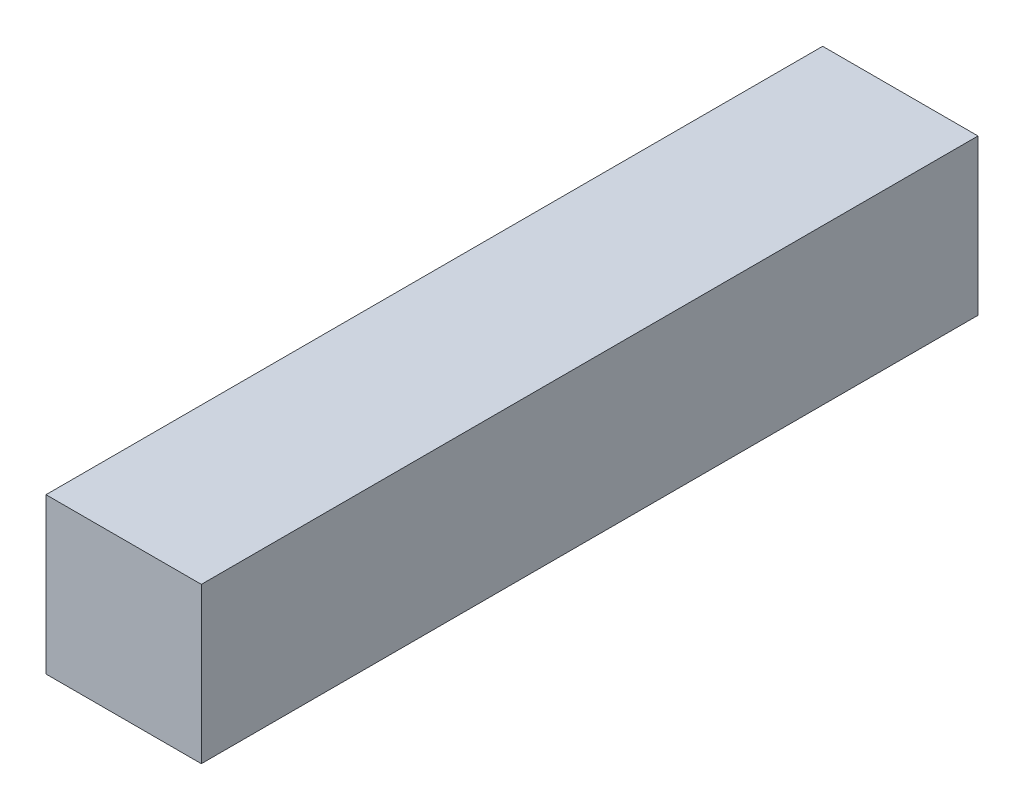
ISO-10303-21;
HEADER;
FILE_DESCRIPTION(('STEP AP214'),'2;1');
FILE_NAME('part.step','',(''),(''),'','','');
FILE_SCHEMA(('AUTOMOTIVE_DESIGN { 1 0 10303 214 1 1 1 1 }'));
ENDSEC;
DATA;
#1=APPLICATION_CONTEXT('core data for automotive mechanical design processes');
#2=APPLICATION_PROTOCOL_DEFINITION('international standard','automotive_design',2000,#1);
#3=PRODUCT_CONTEXT('',#1,'mechanical');
#4=PRODUCT('Part','Part','',(#3));
#5=PRODUCT_RELATED_PRODUCT_CATEGORY('part','',(#4));
#6=PRODUCT_DEFINITION_FORMATION('','',#4);
#7=PRODUCT_DEFINITION_CONTEXT('part definition',#1,'design');
#8=PRODUCT_DEFINITION('design','',#6,#7);
#9=PRODUCT_DEFINITION_SHAPE('','',#8);
#10=(LENGTH_UNIT() NAMED_UNIT(*) SI_UNIT(.MILLI.,.METRE.));
#11=(NAMED_UNIT(*) PLANE_ANGLE_UNIT() SI_UNIT($,.RADIAN.));
#12=(NAMED_UNIT(*) SI_UNIT($,.STERADIAN.) SOLID_ANGLE_UNIT());
#13=UNCERTAINTY_MEASURE_WITH_UNIT(LENGTH_MEASURE(1.E-05),#10,'distance_accuracy_value','');
#14=(GEOMETRIC_REPRESENTATION_CONTEXT(3) GLOBAL_UNCERTAINTY_ASSIGNED_CONTEXT((#13)) GLOBAL_UNIT_ASSIGNED_CONTEXT((#10,
#11,#12)) REPRESENTATION_CONTEXT('',''));
#15=CARTESIAN_POINT('',(0.,0.,0.));
#16=DIRECTION('',(0.,0.,1.));
#17=DIRECTION('',(1.,0.,0.));
#18=AXIS2_PLACEMENT_3D('',#15,#16,#17);
#19=CARTESIAN_POINT('',(1.5,-1.5,15.));
#20=DIRECTION('',(-1.,0.,0.));
#21=DIRECTION('',(0.,0.,1.));
#22=AXIS2_PLACEMENT_3D('',#19,#20,#21);
#23=PLANE('',#22);
#24=DIRECTION('',(0.,1.,0.));
#25=VECTOR('',#24,1.);
#26=CARTESIAN_POINT('',(1.5,-1.5,0.));
#27=LINE('',#26,#25);
#28=CARTESIAN_POINT('',(1.5,-1.5,0.));
#29=VERTEX_POINT('',#28);
#30=CARTESIAN_POINT('',(1.5,1.5,0.));
#31=VERTEX_POINT('',#30);
#32=EDGE_CURVE('E102',#29,#31,#27,.T.);
#33=ORIENTED_EDGE('',*,*,#32,.T.);
#34=DIRECTION('',(0.,0.,-1.));
#35=VECTOR('',#34,1.);
#36=CARTESIAN_POINT('',(1.5,1.5,15.));
#37=LINE('',#36,#35);
#38=CARTESIAN_POINT('',(1.5,1.5,15.));
#39=VERTEX_POINT('',#38);
#40=EDGE_CURVE('E11',#39,#31,#37,.T.);
#41=ORIENTED_EDGE('',*,*,#40,.F.);
#42=DIRECTION('',(0.,1.,0.));
#43=VECTOR('',#42,1.);
#44=CARTESIAN_POINT('',(1.5,-1.5,15.));
#45=LINE('',#44,#43);
#46=CARTESIAN_POINT('',(1.5,-1.5,15.));
#47=VERTEX_POINT('',#46);
#48=EDGE_CURVE('E90',#47,#39,#45,.T.);
#49=ORIENTED_EDGE('',*,*,#48,.F.);
#50=DIRECTION('',(0.,0.,-1.));
#51=VECTOR('',#50,1.);
#52=CARTESIAN_POINT('',(1.5,-1.5,15.));
#53=LINE('',#52,#51);
#54=EDGE_CURVE('E98',#47,#29,#53,.T.);
#55=ORIENTED_EDGE('',*,*,#54,.T.);
#56=EDGE_LOOP('',(#33,#41,#49,#55));
#57=FACE_BOUND('',#56,.T.);
#58=ADVANCED_FACE('F39',(#57),#23,.F.);
#59=CARTESIAN_POINT('',(-1.5,1.5,15.));
#60=DIRECTION('',(0.,-1.,0.));
#61=DIRECTION('',(0.,0.,-1.));
#62=AXIS2_PLACEMENT_3D('',#59,#60,#61);
#63=PLANE('',#62);
#64=DIRECTION('',(-1.,0.,0.));
#65=VECTOR('',#64,1.);
#66=CARTESIAN_POINT('',(-1.5,1.5,0.));
#67=LINE('',#66,#65);
#68=CARTESIAN_POINT('',(-1.5,1.5,0.));
#69=VERTEX_POINT('',#68);
#70=EDGE_CURVE('E94',#31,#69,#67,.T.);
#71=ORIENTED_EDGE('',*,*,#70,.T.);
#72=DIRECTION('',(0.,0.,-1.));
#73=VECTOR('',#72,1.);
#74=CARTESIAN_POINT('',(-1.5,1.5,15.));
#75=LINE('',#74,#73);
#76=CARTESIAN_POINT('',(-1.5,1.5,15.));
#77=VERTEX_POINT('',#76);
#78=EDGE_CURVE('E47',#77,#69,#75,.T.);
#79=ORIENTED_EDGE('',*,*,#78,.F.);
#80=DIRECTION('',(-1.,0.,0.));
#81=VECTOR('',#80,1.);
#82=CARTESIAN_POINT('',(-1.5,1.5,15.));
#83=LINE('',#82,#81);
#84=EDGE_CURVE('E85',#39,#77,#83,.T.);
#85=ORIENTED_EDGE('',*,*,#84,.F.);
#86=ORIENTED_EDGE('',*,*,#40,.T.);
#87=EDGE_LOOP('',(#71,#79,#85,#86));
#88=FACE_BOUND('',#87,.T.);
#89=ADVANCED_FACE('F93',(#88),#63,.F.);
#90=CARTESIAN_POINT('',(-1.5,-1.5,15.));
#91=DIRECTION('',(1.,0.,0.));
#92=DIRECTION('',(0.,0.,-1.));
#93=AXIS2_PLACEMENT_3D('',#90,#91,#92);
#94=PLANE('',#93);
#95=DIRECTION('',(0.,-1.,0.));
#96=VECTOR('',#95,1.);
#97=CARTESIAN_POINT('',(-1.5,-1.5,0.));
#98=LINE('',#97,#96);
#99=CARTESIAN_POINT('',(-1.5,-1.5,0.));
#100=VERTEX_POINT('',#99);
#101=EDGE_CURVE('E72',#69,#100,#98,.T.);
#102=ORIENTED_EDGE('',*,*,#101,.T.);
#103=DIRECTION('',(0.,0.,-1.));
#104=VECTOR('',#103,1.);
#105=CARTESIAN_POINT('',(-1.5,-1.5,15.));
#106=LINE('',#105,#104);
#107=CARTESIAN_POINT('',(-1.5,-1.5,15.));
#108=VERTEX_POINT('',#107);
#109=EDGE_CURVE('E95',#108,#100,#106,.T.);
#110=ORIENTED_EDGE('',*,*,#109,.F.);
#111=DIRECTION('',(0.,-1.,0.));
#112=VECTOR('',#111,1.);
#113=CARTESIAN_POINT('',(-1.5,-1.5,15.));
#114=LINE('',#113,#112);
#115=EDGE_CURVE('E88',#77,#108,#114,.T.);
#116=ORIENTED_EDGE('',*,*,#115,.F.);
#117=ORIENTED_EDGE('',*,*,#78,.T.);
#118=EDGE_LOOP('',(#102,#110,#116,#117));
#119=FACE_BOUND('',#118,.T.);
#120=ADVANCED_FACE('F96',(#119),#94,.F.);
#121=CARTESIAN_POINT('',(-1.5,-1.5,15.));
#122=DIRECTION('',(0.,1.,0.));
#123=DIRECTION('',(0.,0.,1.));
#124=AXIS2_PLACEMENT_3D('',#121,#122,#123);
#125=PLANE('',#124);
#126=DIRECTION('',(1.,0.,0.));
#127=VECTOR('',#126,1.);
#128=CARTESIAN_POINT('',(-1.5,-1.5,0.));
#129=LINE('',#128,#127);
#130=EDGE_CURVE('E78',#100,#29,#129,.T.);
#131=ORIENTED_EDGE('',*,*,#130,.T.);
#132=ORIENTED_EDGE('',*,*,#54,.F.);
#133=DIRECTION('',(1.,0.,0.));
#134=VECTOR('',#133,1.);
#135=CARTESIAN_POINT('',(-1.5,-1.5,15.));
#136=LINE('',#135,#134);
#137=EDGE_CURVE('E55',#108,#47,#136,.T.);
#138=ORIENTED_EDGE('',*,*,#137,.F.);
#139=ORIENTED_EDGE('',*,*,#109,.T.);
#140=EDGE_LOOP('',(#131,#132,#138,#139));
#141=FACE_BOUND('',#140,.T.);
#142=ADVANCED_FACE('F109',(#141),#125,.F.);
#143=CARTESIAN_POINT('',(0.,0.,15.));
#144=DIRECTION('',(0.,0.,-1.));
#145=DIRECTION('',(-1.,0.,0.));
#146=AXIS2_PLACEMENT_3D('',#143,#144,#145);
#147=PLANE('',#146);
#148=ORIENTED_EDGE('',*,*,#48,.T.);
#149=ORIENTED_EDGE('',*,*,#84,.T.);
#150=ORIENTED_EDGE('',*,*,#115,.T.);
#151=ORIENTED_EDGE('',*,*,#137,.T.);
#152=EDGE_LOOP('',(#148,#149,#150,#151));
#153=FACE_BOUND('',#152,.T.);
#154=ADVANCED_FACE('F86',(#153),#147,.F.);
#155=CARTESIAN_POINT('',(0.,0.,0.));
#156=DIRECTION('',(0.,0.,-1.));
#157=DIRECTION('',(-1.,0.,0.));
#158=AXIS2_PLACEMENT_3D('',#155,#156,#157);
#159=PLANE('',#158);
#160=ORIENTED_EDGE('',*,*,#32,.F.);
#161=ORIENTED_EDGE('',*,*,#130,.F.);
#162=ORIENTED_EDGE('',*,*,#101,.F.);
#163=ORIENTED_EDGE('',*,*,#70,.F.);
#164=EDGE_LOOP('',(#160,#161,#162,#163));
#165=FACE_BOUND('',#164,.T.);
#166=ADVANCED_FACE('F112',(#165),#159,.T.);
#167=CLOSED_SHELL('',(#58,#89,#120,#142,#154,#166));
#168=MANIFOLD_SOLID_BREP('B2',#167);
#169=ADVANCED_BREP_SHAPE_REPRESENTATION('',(#18,#168),#14);
#170=SHAPE_DEFINITION_REPRESENTATION(#9,#169);
ENDSEC;
END-ISO-10303-21;
